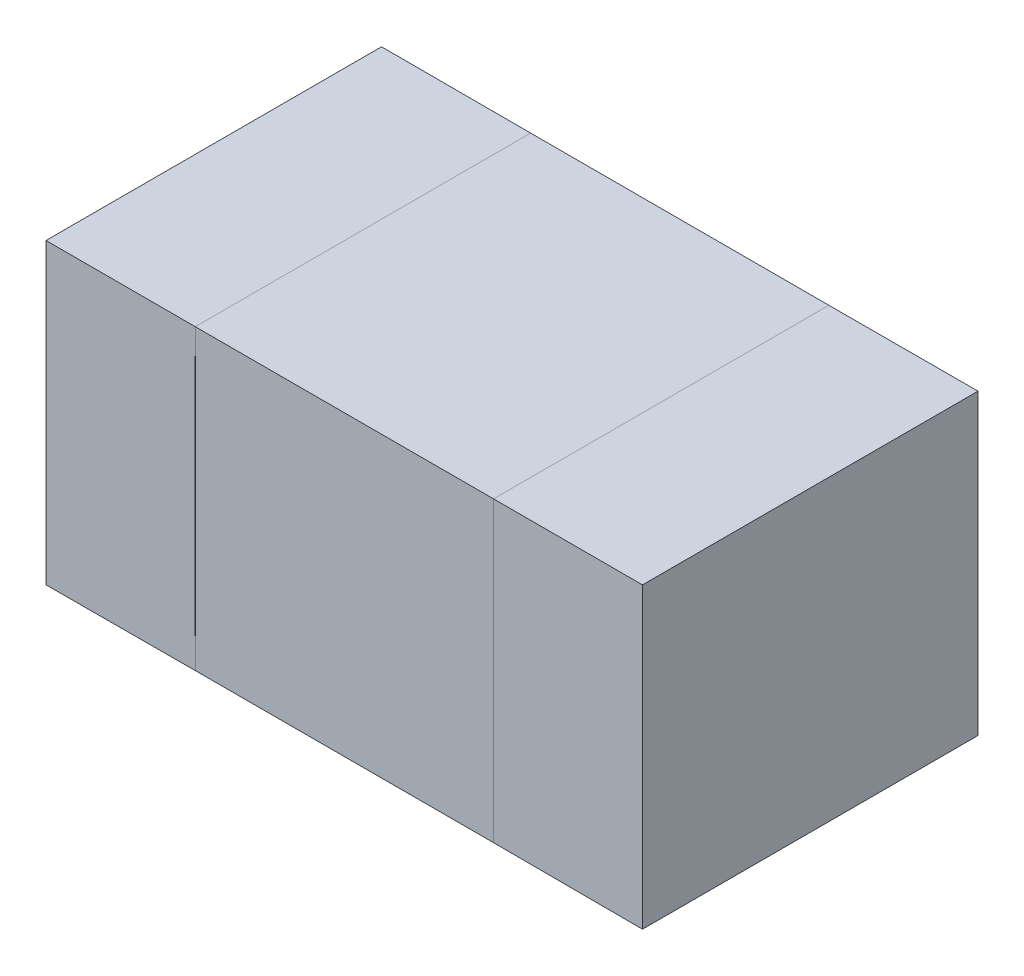
ISO-10303-21;
HEADER;
FILE_DESCRIPTION(('STEP AP214'),'2;1');
FILE_NAME('part.step','',(''),(''),'','','');
FILE_SCHEMA(('AUTOMOTIVE_DESIGN { 1 0 10303 214 1 1 1 1 }'));
ENDSEC;
DATA;
#1=APPLICATION_CONTEXT('core data for automotive mechanical design processes');
#2=APPLICATION_PROTOCOL_DEFINITION('international standard','automotive_design',2000,#1);
#3=PRODUCT_CONTEXT('',#1,'mechanical');
#4=PRODUCT('Part','Part','',(#3));
#5=PRODUCT_RELATED_PRODUCT_CATEGORY('part','',(#4));
#6=PRODUCT_DEFINITION_FORMATION('','',#4);
#7=PRODUCT_DEFINITION_CONTEXT('part definition',#1,'design');
#8=PRODUCT_DEFINITION('design','',#6,#7);
#9=PRODUCT_DEFINITION_SHAPE('','',#8);
#10=(LENGTH_UNIT() NAMED_UNIT(*) SI_UNIT(.MILLI.,.METRE.));
#11=(NAMED_UNIT(*) PLANE_ANGLE_UNIT() SI_UNIT($,.RADIAN.));
#12=(NAMED_UNIT(*) SI_UNIT($,.STERADIAN.) SOLID_ANGLE_UNIT());
#13=UNCERTAINTY_MEASURE_WITH_UNIT(LENGTH_MEASURE(1.E-05),#10,'distance_accuracy_value','');
#14=(GEOMETRIC_REPRESENTATION_CONTEXT(3) GLOBAL_UNCERTAINTY_ASSIGNED_CONTEXT((#13)) GLOBAL_UNIT_ASSIGNED_CONTEXT((#10,
#11,#12)) REPRESENTATION_CONTEXT('',''));
#15=CARTESIAN_POINT('',(0.,0.,0.));
#16=DIRECTION('',(0.,0.,1.));
#17=DIRECTION('',(1.,0.,0.));
#18=AXIS2_PLACEMENT_3D('',#15,#16,#17);
#19=CARTESIAN_POINT('',(0.399,-0.401,0.9));
#20=DIRECTION('',(0.,0.,1.));
#21=DIRECTION('',(1.,0.,0.));
#22=AXIS2_PLACEMENT_3D('',#19,#20,#21);
#23=PLANE('',#22);
#24=DIRECTION('',(0.,-1.,0.));
#25=VECTOR('',#24,1.);
#26=CARTESIAN_POINT('',(0.8,0.,0.9));
#27=LINE('',#26,#25);
#28=CARTESIAN_POINT('',(0.8,0.4,0.9));
#29=VERTEX_POINT('',#28);
#30=CARTESIAN_POINT('',(0.8,-0.4,0.9));
#31=VERTEX_POINT('',#30);
#32=EDGE_CURVE('E110',#29,#31,#27,.T.);
#33=ORIENTED_EDGE('',*,*,#32,.F.);
#34=DIRECTION('',(1.,0.,0.));
#35=VECTOR('',#34,1.);
#36=CARTESIAN_POINT('',(0.6,0.4,0.9));
#37=LINE('',#36,#35);
#38=CARTESIAN_POINT('',(0.4,0.3995,0.8995));
#39=VERTEX_POINT('',#38);
#40=EDGE_CURVE('E108',#39,#29,#37,.T.);
#41=ORIENTED_EDGE('',*,*,#40,.F.);
#42=CARTESIAN_POINT('',(0.400000000000044,-0.4,0.9));
#43=DIRECTION('',(0.,1.,0.));
#44=VECTOR('',#43,1.);
#45=LINE('',#42,#44);
#46=CARTESIAN_POINT('',(0.400000000000022,-0.3994,0.8993));
#47=VERTEX_POINT('',#46);
#48=EDGE_CURVE('E93',#47,#39,#45,.T.);
#49=ORIENTED_EDGE('',*,*,#48,.F.);
#50=DIRECTION('',(-1.,0.,0.));
#51=VECTOR('',#50,1.);
#52=CARTESIAN_POINT('',(0.6,-0.4,0.9));
#53=LINE('',#52,#51);
#54=EDGE_CURVE('E358',#31,#47,#53,.T.);
#55=ORIENTED_EDGE('',*,*,#54,.F.);
#56=EDGE_LOOP('',(#33,#41,#49,#55));
#57=FACE_BOUND('',#56,.T.);
#58=ADVANCED_FACE('F17',(#57),#23,.T.);
#59=CARTESIAN_POINT('',(0.4,0.401,-0.00100000000000003));
#60=DIRECTION('',(-1.,0.,0.));
#61=DIRECTION('',(0.,-1.,0.));
#62=AXIS2_PLACEMENT_3D('',#59,#60,#61);
#63=PLANE('',#62);
#64=CARTESIAN_POINT('',(0.400000000000044,-0.399,0.899));
#65=DIRECTION('',(0.,1.,0.));
#66=VECTOR('',#65,1.);
#67=LINE('',#64,#66);
#68=CARTESIAN_POINT('',(0.4,0.3995,0.8995));
#69=VERTEX_POINT('',#68);
#70=EDGE_CURVE('E36',#47,#69,#67,.T.);
#71=ORIENTED_EDGE('',*,*,#70,.F.);
#72=ORIENTED_EDGE('',*,*,#48,.T.);
#73=CARTESIAN_POINT('',(0.4,0.4,0.));
#74=DIRECTION('',(0.,0.,1.));
#75=VECTOR('',#74,1.);
#76=LINE('',#73,#75);
#77=CARTESIAN_POINT('',(0.4,0.3995,0.));
#78=VERTEX_POINT('',#77);
#79=EDGE_CURVE('E98',#78,#39,#76,.T.);
#80=ORIENTED_EDGE('',*,*,#79,.F.);
#81=CARTESIAN_POINT('',(0.4,0.399,0.899));
#82=DIRECTION('',(0.,0.,-1.));
#83=VECTOR('',#82,1.);
#84=LINE('',#81,#83);
#85=EDGE_CURVE('E214',#69,#78,#84,.T.);
#86=ORIENTED_EDGE('',*,*,#85,.F.);
#87=EDGE_LOOP('',(#71,#72,#80,#86));
#88=FACE_BOUND('',#87,.T.);
#89=ADVANCED_FACE('F96',(#88),#63,.T.);
#90=CARTESIAN_POINT('',(0.399,0.4,-0.00100000000000003));
#91=DIRECTION('',(0.,1.,0.));
#92=DIRECTION('',(0.,0.,1.));
#93=AXIS2_PLACEMENT_3D('',#90,#91,#92);
#94=PLANE('',#93);
#95=ORIENTED_EDGE('',*,*,#40,.T.);
#96=DIRECTION('',(0.,0.,1.));
#97=VECTOR('',#96,1.);
#98=CARTESIAN_POINT('',(0.8,0.4,0.45));
#99=LINE('',#98,#97);
#100=CARTESIAN_POINT('',(0.8,0.4,0.));
#101=VERTEX_POINT('',#100);
#102=EDGE_CURVE('E113',#101,#29,#99,.T.);
#103=ORIENTED_EDGE('',*,*,#102,.F.);
#104=DIRECTION('',(1.,0.,0.));
#105=VECTOR('',#104,1.);
#106=CARTESIAN_POINT('',(0.,0.4,0.));
#107=LINE('',#106,#105);
#108=EDGE_CURVE('E119',#78,#101,#107,.T.);
#109=ORIENTED_EDGE('',*,*,#108,.F.);
#110=ORIENTED_EDGE('',*,*,#79,.T.);
#111=EDGE_LOOP('',(#95,#103,#109,#110));
#112=FACE_BOUND('',#111,.T.);
#113=ADVANCED_FACE('F117',(#112),#94,.T.);
#114=CARTESIAN_POINT('',(0.8,-0.401,-0.00100000000000003));
#115=DIRECTION('',(1.,0.,0.));
#116=DIRECTION('',(0.,1.,0.));
#117=AXIS2_PLACEMENT_3D('',#114,#115,#116);
#118=PLANE('',#117);
#119=ORIENTED_EDGE('',*,*,#32,.T.);
#120=DIRECTION('',(0.,0.,1.));
#121=VECTOR('',#120,1.);
#122=CARTESIAN_POINT('',(0.8,-0.4,0.45));
#123=LINE('',#122,#121);
#124=CARTESIAN_POINT('',(0.8,-0.4,0.));
#125=VERTEX_POINT('',#124);
#126=EDGE_CURVE('E355',#125,#31,#123,.T.);
#127=ORIENTED_EDGE('',*,*,#126,.F.);
#128=DIRECTION('',(0.,-1.,0.));
#129=VECTOR('',#128,1.);
#130=CARTESIAN_POINT('',(0.8,0.,0.));
#131=LINE('',#130,#129);
#132=EDGE_CURVE('E330',#101,#125,#131,.T.);
#133=ORIENTED_EDGE('',*,*,#132,.F.);
#134=ORIENTED_EDGE('',*,*,#102,.T.);
#135=EDGE_LOOP('',(#119,#127,#133,#134));
#136=FACE_BOUND('',#135,.T.);
#137=ADVANCED_FACE('F138',(#136),#118,.T.);
#138=CARTESIAN_POINT('',(0.399,-0.4,0.901));
#139=DIRECTION('',(0.,-1.,0.));
#140=DIRECTION('',(0.,0.,-1.));
#141=AXIS2_PLACEMENT_3D('',#138,#139,#140);
#142=PLANE('',#141);
#143=DIRECTION('',(-1.,0.,0.));
#144=VECTOR('',#143,1.);
#145=CARTESIAN_POINT('',(0.,-0.4,0.));
#146=LINE('',#145,#144);
#147=CARTESIAN_POINT('',(0.4,-0.3995,0.));
#148=VERTEX_POINT('',#147);
#149=EDGE_CURVE('E321',#125,#148,#146,.T.);
#150=ORIENTED_EDGE('',*,*,#149,.F.);
#151=ORIENTED_EDGE('',*,*,#126,.T.);
#152=ORIENTED_EDGE('',*,*,#54,.T.);
#153=CARTESIAN_POINT('',(0.4,-0.399,0.));
#154=DIRECTION('',(0.,0.,1.));
#155=VECTOR('',#154,1.);
#156=LINE('',#153,#155);
#157=EDGE_CURVE('E175',#148,#47,#156,.T.);
#158=ORIENTED_EDGE('',*,*,#157,.F.);
#159=EDGE_LOOP('',(#150,#151,#152,#158));
#160=FACE_BOUND('',#159,.T.);
#161=ADVANCED_FACE('F143',(#160),#142,.T.);
#162=CARTESIAN_POINT('',(-0.401,-0.399,0.9));
#163=DIRECTION('',(0.,-1.,0.));
#164=DIRECTION('',(0.,0.,-1.));
#165=AXIS2_PLACEMENT_3D('',#162,#163,#164);
#166=PLANE('',#165);
#167=CARTESIAN_POINT('',(-0.4,-0.399,0.));
#168=DIRECTION('',(0.,0.,1.));
#169=VECTOR('',#168,1.);
#170=LINE('',#167,#169);
#171=CARTESIAN_POINT('',(-0.4,-0.3995,0.));
#172=VERTEX_POINT('',#171);
#173=CARTESIAN_POINT('',(-0.4,-0.3995,0.8995));
#174=VERTEX_POINT('',#173);
#175=EDGE_CURVE('E164',#172,#174,#170,.T.);
#176=ORIENTED_EDGE('',*,*,#175,.F.);
#177=DIRECTION('',(-1.,0.,0.));
#178=VECTOR('',#177,1.);
#179=CARTESIAN_POINT('',(0.,-0.399,0.));
#180=LINE('',#179,#178);
#181=EDGE_CURVE('E71',#148,#172,#180,.T.);
#182=ORIENTED_EDGE('',*,*,#181,.F.);
#183=ORIENTED_EDGE('',*,*,#157,.T.);
#184=DIRECTION('',(1.,0.,0.));
#185=VECTOR('',#184,1.);
#186=CARTESIAN_POINT('',(0.,-0.399,0.899));
#187=LINE('',#186,#185);
#188=EDGE_CURVE('E349',#174,#47,#187,.T.);
#189=ORIENTED_EDGE('',*,*,#188,.F.);
#190=EDGE_LOOP('',(#176,#182,#183,#189));
#191=FACE_BOUND('',#190,.T.);
#192=ADVANCED_FACE('F148',(#191),#166,.T.);
#193=CARTESIAN_POINT('',(-0.401,-0.4,0.899));
#194=DIRECTION('',(0.,0.,1.));
#195=DIRECTION('',(1.,0.,0.));
#196=AXIS2_PLACEMENT_3D('',#193,#194,#195);
#197=PLANE('',#196);
#198=CARTESIAN_POINT('',(-0.4,-0.399,0.899));
#199=DIRECTION('',(0.,1.,0.));
#200=VECTOR('',#199,1.);
#201=LINE('',#198,#200);
#202=CARTESIAN_POINT('',(-0.4,0.3995,0.8996));
#203=VERTEX_POINT('',#202);
#204=EDGE_CURVE('E187',#174,#203,#201,.T.);
#205=ORIENTED_EDGE('',*,*,#204,.F.);
#206=ORIENTED_EDGE('',*,*,#188,.T.);
#207=ORIENTED_EDGE('',*,*,#70,.T.);
#208=DIRECTION('',(1.,0.,0.));
#209=VECTOR('',#208,1.);
#210=CARTESIAN_POINT('',(0.,0.399,0.899));
#211=LINE('',#210,#209);
#212=EDGE_CURVE('E347',#203,#69,#211,.T.);
#213=ORIENTED_EDGE('',*,*,#212,.F.);
#214=EDGE_LOOP('',(#205,#206,#207,#213));
#215=FACE_BOUND('',#214,.T.);
#216=ADVANCED_FACE('F191',(#215),#197,.T.);
#217=CARTESIAN_POINT('',(-0.401,0.399,-0.00100000000000003));
#218=DIRECTION('',(0.,1.,0.));
#219=DIRECTION('',(0.,0.,1.));
#220=AXIS2_PLACEMENT_3D('',#217,#218,#219);
#221=PLANE('',#220);
#222=ORIENTED_EDGE('',*,*,#85,.T.);
#223=DIRECTION('',(1.,0.,0.));
#224=VECTOR('',#223,1.);
#225=CARTESIAN_POINT('',(0.,0.399,0.));
#226=LINE('',#225,#224);
#227=CARTESIAN_POINT('',(-0.4,0.3995,0.));
#228=VERTEX_POINT('',#227);
#229=EDGE_CURVE('E59',#228,#78,#226,.T.);
#230=ORIENTED_EDGE('',*,*,#229,.F.);
#231=CARTESIAN_POINT('',(-0.4,0.4,0.9));
#232=DIRECTION('',(0.,0.,-1.));
#233=VECTOR('',#232,1.);
#234=LINE('',#231,#233);
#235=EDGE_CURVE('E225',#203,#228,#234,.T.);
#236=ORIENTED_EDGE('',*,*,#235,.F.);
#237=ORIENTED_EDGE('',*,*,#212,.T.);
#238=EDGE_LOOP('',(#222,#230,#236,#237));
#239=FACE_BOUND('',#238,.T.);
#240=ADVANCED_FACE('F200',(#239),#221,.T.);
#241=CARTESIAN_POINT('',(0.801000000000001,-0.401,0.));
#242=DIRECTION('',(0.,0.,-1.));
#243=DIRECTION('',(-1.,0.,0.));
#244=AXIS2_PLACEMENT_3D('',#241,#242,#243);
#245=PLANE('',#244);
#246=ORIENTED_EDGE('',*,*,#132,.T.);
#247=ORIENTED_EDGE('',*,*,#149,.T.);
#248=ORIENTED_EDGE('',*,*,#181,.T.);
#249=DIRECTION('',(1.,0.,0.));
#250=VECTOR('',#249,1.);
#251=CARTESIAN_POINT('',(-0.6,-0.4,0.));
#252=LINE('',#251,#250);
#253=CARTESIAN_POINT('',(-0.8,-0.4,0.));
#254=VERTEX_POINT('',#253);
#255=EDGE_CURVE('E319',#254,#172,#252,.T.);
#256=ORIENTED_EDGE('',*,*,#255,.F.);
#257=DIRECTION('',(0.,-1.,0.));
#258=VECTOR('',#257,1.);
#259=CARTESIAN_POINT('',(-0.8,0.,0.));
#260=LINE('',#259,#258);
#261=CARTESIAN_POINT('',(-0.8,0.4,0.));
#262=VERTEX_POINT('',#261);
#263=EDGE_CURVE('E314',#262,#254,#260,.T.);
#264=ORIENTED_EDGE('',*,*,#263,.F.);
#265=DIRECTION('',(-1.,0.,0.));
#266=VECTOR('',#265,1.);
#267=CARTESIAN_POINT('',(-0.6,0.4,0.));
#268=LINE('',#267,#266);
#269=EDGE_CURVE('E326',#228,#262,#268,.T.);
#270=ORIENTED_EDGE('',*,*,#269,.F.);
#271=ORIENTED_EDGE('',*,*,#229,.T.);
#272=ORIENTED_EDGE('',*,*,#108,.T.);
#273=EDGE_LOOP('',(#246,#247,#248,#256,#264,#270,#271,#272));
#274=FACE_BOUND('',#273,.T.);
#275=ADVANCED_FACE('F254',(#274),#245,.T.);
#276=CARTESIAN_POINT('',(-0.801,-0.4,0.901));
#277=DIRECTION('',(0.,-1.,0.));
#278=DIRECTION('',(0.,0.,-1.));
#279=AXIS2_PLACEMENT_3D('',#276,#277,#278);
#280=PLANE('',#279);
#281=DIRECTION('',(1.,0.,0.));
#282=VECTOR('',#281,1.);
#283=CARTESIAN_POINT('',(-0.6,-0.4,0.9));
#284=LINE('',#283,#282);
#285=CARTESIAN_POINT('',(-0.8,-0.4,0.9));
#286=VERTEX_POINT('',#285);
#287=CARTESIAN_POINT('',(-0.4,-0.3995,0.8995));
#288=VERTEX_POINT('',#287);
#289=EDGE_CURVE('E297',#286,#288,#284,.T.);
#290=ORIENTED_EDGE('',*,*,#289,.F.);
#291=DIRECTION('',(0.,0.,1.));
#292=VECTOR('',#291,1.);
#293=CARTESIAN_POINT('',(-0.8,-0.4,0.45));
#294=LINE('',#293,#292);
#295=EDGE_CURVE('E305',#254,#286,#294,.T.);
#296=ORIENTED_EDGE('',*,*,#295,.F.);
#297=ORIENTED_EDGE('',*,*,#255,.T.);
#298=CARTESIAN_POINT('',(-0.4,-0.4,0.9));
#299=DIRECTION('',(0.,0.,-1.));
#300=VECTOR('',#299,1.);
#301=LINE('',#298,#300);
#302=EDGE_CURVE('E237',#288,#172,#301,.T.);
#303=ORIENTED_EDGE('',*,*,#302,.F.);
#304=EDGE_LOOP('',(#290,#296,#297,#303));
#305=FACE_BOUND('',#304,.T.);
#306=ADVANCED_FACE('F244',(#305),#280,.T.);
#307=CARTESIAN_POINT('',(-0.4,-0.401,0.901));
#308=DIRECTION('',(1.,0.,0.));
#309=DIRECTION('',(0.,0.,-1.));
#310=AXIS2_PLACEMENT_3D('',#307,#308,#309);
#311=PLANE('',#310);
#312=ORIENTED_EDGE('',*,*,#204,.T.);
#313=DIRECTION('',(0.,1.,0.));
#314=VECTOR('',#313,1.);
#315=CARTESIAN_POINT('',(-0.4,-0.401,0.9));
#316=LINE('',#315,#314);
#317=EDGE_CURVE('E290',#288,#203,#316,.T.);
#318=ORIENTED_EDGE('',*,*,#317,.F.);
#319=ORIENTED_EDGE('',*,*,#302,.T.);
#320=ORIENTED_EDGE('',*,*,#175,.T.);
#321=EDGE_LOOP('',(#312,#318,#319,#320));
#322=FACE_BOUND('',#321,.T.);
#323=ADVANCED_FACE('F253',(#322),#311,.T.);
#324=CARTESIAN_POINT('',(-0.801,0.4,-0.00100000000000003));
#325=DIRECTION('',(0.,1.,0.));
#326=DIRECTION('',(0.,0.,1.));
#327=AXIS2_PLACEMENT_3D('',#324,#325,#326);
#328=PLANE('',#327);
#329=ORIENTED_EDGE('',*,*,#269,.T.);
#330=DIRECTION('',(0.,0.,-1.));
#331=VECTOR('',#330,1.);
#332=CARTESIAN_POINT('',(-0.8,0.4,0.45));
#333=LINE('',#332,#331);
#334=CARTESIAN_POINT('',(-0.8,0.4,0.9));
#335=VERTEX_POINT('',#334);
#336=EDGE_CURVE('E302',#335,#262,#333,.T.);
#337=ORIENTED_EDGE('',*,*,#336,.F.);
#338=DIRECTION('',(-1.,0.,0.));
#339=VECTOR('',#338,1.);
#340=CARTESIAN_POINT('',(-0.6,0.4,0.9));
#341=LINE('',#340,#339);
#342=EDGE_CURVE('E27',#203,#335,#341,.T.);
#343=ORIENTED_EDGE('',*,*,#342,.F.);
#344=ORIENTED_EDGE('',*,*,#235,.T.);
#345=EDGE_LOOP('',(#329,#337,#343,#344));
#346=FACE_BOUND('',#345,.T.);
#347=ADVANCED_FACE('F258',(#346),#328,.T.);
#348=CARTESIAN_POINT('',(-0.8,0.401,-0.00100000000000003));
#349=DIRECTION('',(-1.,0.,0.));
#350=DIRECTION('',(0.,-1.,0.));
#351=AXIS2_PLACEMENT_3D('',#348,#349,#350);
#352=PLANE('',#351);
#353=DIRECTION('',(0.,-1.,0.));
#354=VECTOR('',#353,1.);
#355=CARTESIAN_POINT('',(-0.8,0.,0.9));
#356=LINE('',#355,#354);
#357=EDGE_CURVE('E11',#335,#286,#356,.T.);
#358=ORIENTED_EDGE('',*,*,#357,.F.);
#359=ORIENTED_EDGE('',*,*,#336,.T.);
#360=ORIENTED_EDGE('',*,*,#263,.T.);
#361=ORIENTED_EDGE('',*,*,#295,.T.);
#362=EDGE_LOOP('',(#358,#359,#360,#361));
#363=FACE_BOUND('',#362,.T.);
#364=ADVANCED_FACE('F389',(#363),#352,.T.);
#365=CARTESIAN_POINT('',(-0.801,-0.401,0.9));
#366=DIRECTION('',(0.,0.,1.));
#367=DIRECTION('',(1.,0.,0.));
#368=AXIS2_PLACEMENT_3D('',#365,#366,#367);
#369=PLANE('',#368);
#370=ORIENTED_EDGE('',*,*,#342,.T.);
#371=ORIENTED_EDGE('',*,*,#357,.T.);
#372=ORIENTED_EDGE('',*,*,#289,.T.);
#373=ORIENTED_EDGE('',*,*,#317,.T.);
#374=EDGE_LOOP('',(#370,#371,#372,#373));
#375=FACE_BOUND('',#374,.T.);
#376=ADVANCED_FACE('F19',(#375),#369,.T.);
#377=CLOSED_SHELL('',(#58,#89,#113,#137,#161,#192,#216,#240,#275,#306,#323,#347,#364,#376));
#378=MANIFOLD_SOLID_BREP('B1',#377);
#379=ADVANCED_BREP_SHAPE_REPRESENTATION('',(#18,#378),#14);
#380=SHAPE_DEFINITION_REPRESENTATION(#9,#379);
ENDSEC;
END-ISO-10303-21;
